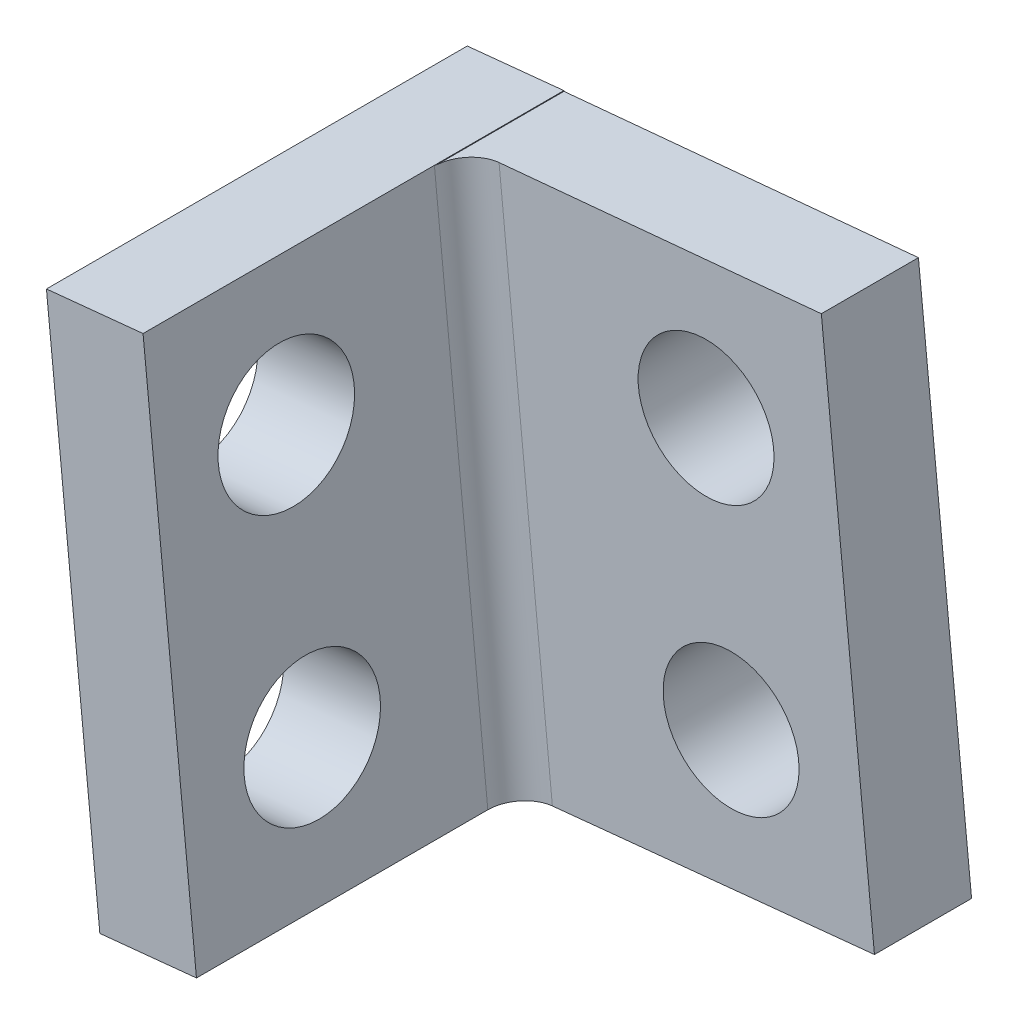
ISO-10303-21;
HEADER;
FILE_DESCRIPTION(('STEP AP214'),'2;1');
FILE_NAME('part.step','',(''),(''),'','','');
FILE_SCHEMA(('AUTOMOTIVE_DESIGN { 1 0 10303 214 1 1 1 1 }'));
ENDSEC;
DATA;
#1=APPLICATION_CONTEXT('core data for automotive mechanical design processes');
#2=APPLICATION_PROTOCOL_DEFINITION('international standard','automotive_design',2000,#1);
#3=PRODUCT_CONTEXT('',#1,'mechanical');
#4=PRODUCT('Part','Part','',(#3));
#5=PRODUCT_RELATED_PRODUCT_CATEGORY('part','',(#4));
#6=PRODUCT_DEFINITION_FORMATION('','',#4);
#7=PRODUCT_DEFINITION_CONTEXT('part definition',#1,'design');
#8=PRODUCT_DEFINITION('design','',#6,#7);
#9=PRODUCT_DEFINITION_SHAPE('','',#8);
#10=(LENGTH_UNIT() NAMED_UNIT(*) SI_UNIT(.MILLI.,.METRE.));
#11=(NAMED_UNIT(*) PLANE_ANGLE_UNIT() SI_UNIT($,.RADIAN.));
#12=(NAMED_UNIT(*) SI_UNIT($,.STERADIAN.) SOLID_ANGLE_UNIT());
#13=UNCERTAINTY_MEASURE_WITH_UNIT(LENGTH_MEASURE(1.E-05),#10,'distance_accuracy_value','');
#14=(GEOMETRIC_REPRESENTATION_CONTEXT(3) GLOBAL_UNCERTAINTY_ASSIGNED_CONTEXT((#13)) GLOBAL_UNIT_ASSIGNED_CONTEXT((#10,
#11,#12)) REPRESENTATION_CONTEXT('',''));
#15=CARTESIAN_POINT('',(0.,0.,0.));
#16=DIRECTION('',(0.,0.,1.));
#17=DIRECTION('',(1.,0.,0.));
#18=AXIS2_PLACEMENT_3D('',#15,#16,#17);
#19=CARTESIAN_POINT('',(0.,0.,3.));
#20=DIRECTION('',(0.,0.,1.));
#21=DIRECTION('',(1.,0.,0.));
#22=AXIS2_PLACEMENT_3D('',#19,#20,#21);
#23=PLANE('',#22);
#24=DIRECTION('',(-0.995631992695672,-0.0933645281723446,0.));
#25=VECTOR('',#24,1.);
#26=CARTESIAN_POINT('',(-91.0611521022606,46.0439123563639,3.));
#27=LINE('',#26,#25);
#28=CARTESIAN_POINT('',(-91.0611521022606,46.0439123563639,3.));
#29=VERTEX_POINT('',#28);
#30=CARTESIAN_POINT('',(-101.017383525646,45.1102753739863,3.));
#31=VERTEX_POINT('',#30);
#32=EDGE_CURVE('E154',#29,#31,#27,.T.);
#33=ORIENTED_EDGE('',*,*,#32,.T.);
#34=DIRECTION('',(-0.0999999999999992,0.99498743710662,0.));
#35=VECTOR('',#34,1.);
#36=CARTESIAN_POINT('',(-99.3700502515736,28.7195162496917,3.));
#37=LINE('',#36,#35);
#38=CARTESIAN_POINT('',(-99.3700502515736,28.7195162496917,3.));
#39=VERTEX_POINT('',#38);
#40=EDGE_CURVE('E60',#31,#39,#37,.F.);
#41=ORIENTED_EDGE('',*,*,#40,.T.);
#42=DIRECTION('',(0.99498743710662,0.0999999999999992,0.));
#43=VECTOR('',#42,1.);
#44=CARTESIAN_POINT('',(-103.35,28.3195162496917,3.));
#45=LINE('',#44,#43);
#46=CARTESIAN_POINT('',(-89.4201758805073,29.7195162496917,3.));
#47=VERTEX_POINT('',#46);
#48=EDGE_CURVE('E156',#39,#47,#45,.T.);
#49=ORIENTED_EDGE('',*,*,#48,.T.);
#50=DIRECTION('',(-0.100018867622405,0.994985540658522,0.));
#51=VECTOR('',#50,1.);
#52=CARTESIAN_POINT('',(-89.4201758805073,29.7195162496917,3.));
#53=LINE('',#52,#51);
#54=EDGE_CURVE('E159',#47,#29,#53,.T.);
#55=ORIENTED_EDGE('',*,*,#54,.T.);
#56=EDGE_LOOP('',(#33,#41,#49,#55));
#57=FACE_BOUND('',#56,.T.);
#58=CARTESIAN_POINT('',(-94.6220250588654,41.474945451225,3.));
#59=DIRECTION('',(0.,0.,1.));
#60=DIRECTION('',(1.,0.,0.));
#61=AXIS2_PLACEMENT_3D('',#58,#59,#60);
#62=CIRCLE('',#61,2.1);
#63=CARTESIAN_POINT('',(-92.5220250588654,41.474945451225,3.));
#64=VERTEX_POINT('',#63);
#65=EDGE_CURVE('E148',#64,#64,#62,.T.);
#66=ORIENTED_EDGE('',*,*,#65,.F.);
#67=EDGE_LOOP('',(#66));
#68=FACE_BOUND('',#67,.T.);
#69=CARTESIAN_POINT('',(-93.8485626491029,33.5124234951683,3.));
#70=DIRECTION('',(0.,0.,1.));
#71=DIRECTION('',(1.,0.,0.));
#72=AXIS2_PLACEMENT_3D('',#69,#70,#71);
#73=CIRCLE('',#72,2.1);
#74=CARTESIAN_POINT('',(-91.7485626491029,33.5124234951683,3.));
#75=VERTEX_POINT('',#74);
#76=EDGE_CURVE('E142',#75,#75,#73,.T.);
#77=ORIENTED_EDGE('',*,*,#76,.F.);
#78=EDGE_LOOP('',(#77));
#79=FACE_BOUND('',#78,.T.);
#80=ADVANCED_FACE('F39',(#57,#68,#79),#23,.T.);
#81=CARTESIAN_POINT('',(0.,0.,0.));
#82=DIRECTION('',(0.,0.,1.));
#83=DIRECTION('',(1.,0.,0.));
#84=AXIS2_PLACEMENT_3D('',#81,#82,#83);
#85=PLANE('',#84);
#86=DIRECTION('',(-0.100018867622405,0.994985540658522,0.));
#87=VECTOR('',#86,1.);
#88=CARTESIAN_POINT('',(-89.4201758805073,29.7195162496917,0.));
#89=LINE('',#88,#87);
#90=CARTESIAN_POINT('',(-89.4201758805073,29.7195162496917,0.));
#91=VERTEX_POINT('',#90);
#92=CARTESIAN_POINT('',(-91.0611521022606,46.0439123563639,0.));
#93=VERTEX_POINT('',#92);
#94=EDGE_CURVE('E157',#91,#93,#89,.T.);
#95=ORIENTED_EDGE('',*,*,#94,.F.);
#96=DIRECTION('',(0.99498743710662,0.0999999999999992,0.));
#97=VECTOR('',#96,1.);
#98=CARTESIAN_POINT('',(-103.35,28.3195162496917,0.));
#99=LINE('',#98,#97);
#100=CARTESIAN_POINT('',(-103.35,28.3195162496917,0.));
#101=VERTEX_POINT('',#100);
#102=EDGE_CURVE('E166',#101,#91,#99,.T.);
#103=ORIENTED_EDGE('',*,*,#102,.F.);
#104=DIRECTION('',(0.0999999999999992,-0.99498743710662,0.));
#105=VECTOR('',#104,1.);
#106=CARTESIAN_POINT('',(-105.,44.7368089619511,0.));
#107=LINE('',#106,#105);
#108=CARTESIAN_POINT('',(-105.,44.7368089619511,0.));
#109=VERTEX_POINT('',#108);
#110=EDGE_CURVE('E164',#109,#101,#107,.T.);
#111=ORIENTED_EDGE('',*,*,#110,.F.);
#112=DIRECTION('',(-0.99498743710662,-0.0999999999999992,0.));
#113=VECTOR('',#112,1.);
#114=CARTESIAN_POINT('',(-102.01503768868,45.0368089619511,0.));
#115=LINE('',#114,#113);
#116=CARTESIAN_POINT('',(-102.01503768868,45.0368089619511,0.));
#117=VERTEX_POINT('',#116);
#118=EDGE_CURVE('E136',#117,#109,#115,.T.);
#119=ORIENTED_EDGE('',*,*,#118,.F.);
#120=DIRECTION('',(0.0999999999999992,-0.99498743710662,0.));
#121=VECTOR('',#120,1.);
#122=CARTESIAN_POINT('',(-100.36503768868,28.6195162496917,0.));
#123=LINE('',#122,#121);
#124=CARTESIAN_POINT('',(-102.013037644234,45.0169087709775,0.));
#125=VERTEX_POINT('',#124);
#126=EDGE_CURVE('E115',#117,#125,#123,.T.);
#127=ORIENTED_EDGE('',*,*,#126,.T.);
#128=DIRECTION('',(-0.995631992695672,-0.0933645281723446,0.));
#129=VECTOR('',#128,1.);
#130=CARTESIAN_POINT('',(-91.0611521022606,46.0439123563639,0.));
#131=LINE('',#130,#129);
#132=EDGE_CURVE('E151',#93,#125,#131,.T.);
#133=ORIENTED_EDGE('',*,*,#132,.F.);
#134=EDGE_LOOP('',(#95,#103,#111,#119,#127,#133));
#135=FACE_BOUND('',#134,.T.);
#136=CARTESIAN_POINT('',(-94.6220250588654,41.474945451225,0.));
#137=DIRECTION('',(0.,0.,1.));
#138=DIRECTION('',(1.,0.,0.));
#139=AXIS2_PLACEMENT_3D('',#136,#137,#138);
#140=CIRCLE('',#139,2.1);
#141=CARTESIAN_POINT('',(-92.5220250588654,41.474945451225,0.));
#142=VERTEX_POINT('',#141);
#143=EDGE_CURVE('E145',#142,#142,#140,.T.);
#144=ORIENTED_EDGE('',*,*,#143,.T.);
#145=EDGE_LOOP('',(#144));
#146=FACE_BOUND('',#145,.T.);
#147=CARTESIAN_POINT('',(-93.8485626491029,33.5124234951683,0.));
#148=DIRECTION('',(0.,0.,1.));
#149=DIRECTION('',(1.,0.,0.));
#150=AXIS2_PLACEMENT_3D('',#147,#148,#149);
#151=CIRCLE('',#150,2.1);
#152=CARTESIAN_POINT('',(-91.7485626491029,33.5124234951683,0.));
#153=VERTEX_POINT('',#152);
#154=EDGE_CURVE('E141',#153,#153,#151,.T.);
#155=ORIENTED_EDGE('',*,*,#154,.T.);
#156=EDGE_LOOP('',(#155));
#157=FACE_BOUND('',#156,.T.);
#158=ADVANCED_FACE('F193',(#135,#146,#157),#85,.F.);
#159=CARTESIAN_POINT('',(-91.0611521022606,46.0439123563639,3.));
#160=DIRECTION('',(0.0933645281723446,-0.995631992695672,0.));
#161=DIRECTION('',(0.995631992695672,0.0933645281723446,0.));
#162=AXIS2_PLACEMENT_3D('',#159,#160,#161);
#163=PLANE('',#162);
#164=ORIENTED_EDGE('',*,*,#132,.T.);
#165=DIRECTION('',(0.,0.,1.));
#166=VECTOR('',#165,1.);
#167=CARTESIAN_POINT('',(-102.013037644234,45.0169087709775,3.));
#168=LINE('',#167,#166);
#169=CARTESIAN_POINT('',(-102.013037644234,45.0169087709775,4.));
#170=VERTEX_POINT('',#169);
#171=EDGE_CURVE('E138',#125,#170,#168,.T.);
#172=ORIENTED_EDGE('',*,*,#171,.T.);
#173=CARTESIAN_POINT('',(-101.017383525646,45.1102753739863,4.));
#174=DIRECTION('',(0.0933645281723446,-0.995631992695672,0.));
#175=DIRECTION('',(0.995631992695672,0.0933645281723446,0.));
#176=AXIS2_PLACEMENT_3D('',#173,#174,#175);
#177=ELLIPSE('',#176,1.00002222296299,1.);
#178=EDGE_CURVE('E47',#170,#31,#177,.T.);
#179=ORIENTED_EDGE('',*,*,#178,.T.);
#180=ORIENTED_EDGE('',*,*,#32,.F.);
#181=DIRECTION('',(0.,0.,-1.));
#182=VECTOR('',#181,1.);
#183=CARTESIAN_POINT('',(-91.0611521022606,46.0439123563639,3.));
#184=LINE('',#183,#182);
#185=EDGE_CURVE('E161',#29,#93,#184,.T.);
#186=ORIENTED_EDGE('',*,*,#185,.T.);
#187=EDGE_LOOP('',(#164,#172,#179,#180,#186));
#188=FACE_BOUND('',#187,.T.);
#189=ADVANCED_FACE('F199',(#188),#163,.F.);
#190=CARTESIAN_POINT('',(-105.,44.7368089619511,3.));
#191=DIRECTION('',(0.99498743710662,0.0999999999999991,0.));
#192=DIRECTION('',(-0.0999999999999992,0.99498743710662,0.));
#193=AXIS2_PLACEMENT_3D('',#190,#191,#192);
#194=PLANE('',#193);
#195=ORIENTED_EDGE('',*,*,#110,.T.);
#196=DIRECTION('',(0.,0.,-1.));
#197=VECTOR('',#196,1.);
#198=CARTESIAN_POINT('',(-103.35,28.3195162496917,3.));
#199=LINE('',#198,#197);
#200=CARTESIAN_POINT('',(-103.35,28.3195162496917,13.));
#201=VERTEX_POINT('',#200);
#202=EDGE_CURVE('E174',#201,#101,#199,.T.);
#203=ORIENTED_EDGE('',*,*,#202,.F.);
#204=DIRECTION('',(-0.0999999999999992,0.99498743710662,0.));
#205=VECTOR('',#204,1.);
#206=CARTESIAN_POINT('',(-103.35,28.3195162496917,13.));
#207=LINE('',#206,#205);
#208=CARTESIAN_POINT('',(-105.,44.7368089619511,13.));
#209=VERTEX_POINT('',#208);
#210=EDGE_CURVE('E123',#201,#209,#207,.T.);
#211=ORIENTED_EDGE('',*,*,#210,.T.);
#212=DIRECTION('',(0.,0.,-1.));
#213=VECTOR('',#212,1.);
#214=CARTESIAN_POINT('',(-105.,44.7368089619511,3.));
#215=LINE('',#214,#213);
#216=EDGE_CURVE('E176',#209,#109,#215,.T.);
#217=ORIENTED_EDGE('',*,*,#216,.T.);
#218=EDGE_LOOP('',(#195,#203,#211,#217));
#219=FACE_BOUND('',#218,.T.);
#220=CARTESIAN_POINT('',(-104.575,40.5081123542479,9.));
#221=DIRECTION('',(-0.99498743710662,-0.0999999999999992,0.));
#222=DIRECTION('',(0.0999999999999992,-0.99498743710662,0.));
#223=AXIS2_PLACEMENT_3D('',#220,#221,#222);
#224=CIRCLE('',#223,2.09999999999999);
#225=CARTESIAN_POINT('',(-104.365,38.418638736324,9.));
#226=VERTEX_POINT('',#225);
#227=EDGE_CURVE('E231',#226,#226,#224,.T.);
#228=ORIENTED_EDGE('',*,*,#227,.F.);
#229=EDGE_LOOP('',(#228));
#230=FACE_BOUND('',#229,.T.);
#231=CARTESIAN_POINT('',(-103.775,32.5482128573949,9.));
#232=DIRECTION('',(-0.99498743710662,-0.0999999999999992,0.));
#233=DIRECTION('',(0.0999999999999992,-0.99498743710662,0.));
#234=AXIS2_PLACEMENT_3D('',#231,#232,#233);
#235=CIRCLE('',#234,2.09999999999999);
#236=CARTESIAN_POINT('',(-103.565,30.458739239471,9.));
#237=VERTEX_POINT('',#236);
#238=EDGE_CURVE('E225',#237,#237,#235,.T.);
#239=ORIENTED_EDGE('',*,*,#238,.F.);
#240=EDGE_LOOP('',(#239));
#241=FACE_BOUND('',#240,.T.);
#242=ADVANCED_FACE('F213',(#219,#230,#241),#194,.F.);
#243=CARTESIAN_POINT('',(-103.35,28.3195162496917,3.));
#244=DIRECTION('',(-0.0999999999999992,0.99498743710662,0.));
#245=DIRECTION('',(-0.99498743710662,-0.0999999999999993,0.));
#246=AXIS2_PLACEMENT_3D('',#243,#244,#245);
#247=PLANE('',#246);
#248=ORIENTED_EDGE('',*,*,#48,.F.);
#249=CARTESIAN_POINT('',(-99.3700502515736,28.7195162496917,4.));
#250=DIRECTION('',(-0.0999999999999992,0.99498743710662,0.));
#251=DIRECTION('',(-0.99498743710662,-0.0999999999999993,0.));
#252=AXIS2_PLACEMENT_3D('',#249,#250,#251);
#253=CIRCLE('',#252,1.);
#254=CARTESIAN_POINT('',(-100.36503768868,28.6195162496917,4.));
#255=VERTEX_POINT('',#254);
#256=EDGE_CURVE('E11',#39,#255,#253,.T.);
#257=ORIENTED_EDGE('',*,*,#256,.T.);
#258=DIRECTION('',(0.,0.,1.));
#259=VECTOR('',#258,1.);
#260=CARTESIAN_POINT('',(-100.36503768868,28.6195162496917,0.));
#261=LINE('',#260,#259);
#262=CARTESIAN_POINT('',(-100.36503768868,28.6195162496917,13.));
#263=VERTEX_POINT('',#262);
#264=EDGE_CURVE('E103',#255,#263,#261,.T.);
#265=ORIENTED_EDGE('',*,*,#264,.T.);
#266=DIRECTION('',(-0.99498743710662,-0.0999999999999992,0.));
#267=VECTOR('',#266,1.);
#268=CARTESIAN_POINT('',(-100.36503768868,28.6195162496917,13.));
#269=LINE('',#268,#267);
#270=EDGE_CURVE('E107',#263,#201,#269,.T.);
#271=ORIENTED_EDGE('',*,*,#270,.T.);
#272=ORIENTED_EDGE('',*,*,#202,.T.);
#273=ORIENTED_EDGE('',*,*,#102,.T.);
#274=DIRECTION('',(0.,0.,-1.));
#275=VECTOR('',#274,1.);
#276=CARTESIAN_POINT('',(-89.4201758805073,29.7195162496917,3.));
#277=LINE('',#276,#275);
#278=EDGE_CURVE('E171',#47,#91,#277,.T.);
#279=ORIENTED_EDGE('',*,*,#278,.F.);
#280=EDGE_LOOP('',(#248,#257,#265,#271,#272,#273,#279));
#281=FACE_BOUND('',#280,.T.);
#282=ADVANCED_FACE('F105',(#281),#247,.F.);
#283=CARTESIAN_POINT('',(-89.4201758805073,29.7195162496917,3.));
#284=DIRECTION('',(-0.994985540658522,-0.100018867622405,0.));
#285=DIRECTION('',(0.100018867622405,-0.994985540658522,0.));
#286=AXIS2_PLACEMENT_3D('',#283,#284,#285);
#287=PLANE('',#286);
#288=ORIENTED_EDGE('',*,*,#94,.T.);
#289=ORIENTED_EDGE('',*,*,#185,.F.);
#290=ORIENTED_EDGE('',*,*,#54,.F.);
#291=ORIENTED_EDGE('',*,*,#278,.T.);
#292=EDGE_LOOP('',(#288,#289,#290,#291));
#293=FACE_BOUND('',#292,.T.);
#294=ADVANCED_FACE('F207',(#293),#287,.F.);
#295=CARTESIAN_POINT('',(-94.6220250588654,41.474945451225,3.));
#296=DIRECTION('',(0.,0.,-1.));
#297=DIRECTION('',(-1.,0.,0.));
#298=AXIS2_PLACEMENT_3D('',#295,#296,#297);
#299=CYLINDRICAL_SURFACE('',#298,2.1);
#300=ORIENTED_EDGE('',*,*,#65,.T.);
#301=EDGE_LOOP('',(#300));
#302=FACE_BOUND('',#301,.T.);
#303=ORIENTED_EDGE('',*,*,#143,.F.);
#304=EDGE_LOOP('',(#303));
#305=FACE_BOUND('',#304,.T.);
#306=ADVANCED_FACE('F204',(#302,#305),#299,.F.);
#307=CARTESIAN_POINT('',(-93.8485626491029,33.5124234951683,3.));
#308=DIRECTION('',(0.,0.,-1.));
#309=DIRECTION('',(-1.,0.,0.));
#310=AXIS2_PLACEMENT_3D('',#307,#308,#309);
#311=CYLINDRICAL_SURFACE('',#310,2.1);
#312=ORIENTED_EDGE('',*,*,#76,.T.);
#313=EDGE_LOOP('',(#312));
#314=FACE_BOUND('',#313,.T.);
#315=ORIENTED_EDGE('',*,*,#154,.F.);
#316=EDGE_LOOP('',(#315));
#317=FACE_BOUND('',#316,.T.);
#318=ADVANCED_FACE('F256',(#314,#317),#311,.F.);
#319=CARTESIAN_POINT('',(-102.01503768868,45.0368089619511,0.));
#320=DIRECTION('',(-0.0999999999999992,0.99498743710662,0.));
#321=DIRECTION('',(-0.99498743710662,-0.0999999999999992,0.));
#322=AXIS2_PLACEMENT_3D('',#319,#320,#321);
#323=PLANE('',#322);
#324=ORIENTED_EDGE('',*,*,#216,.F.);
#325=DIRECTION('',(-0.99498743710662,-0.0999999999999992,0.));
#326=VECTOR('',#325,1.);
#327=CARTESIAN_POINT('',(-102.01503768868,45.0368089619511,13.));
#328=LINE('',#327,#326);
#329=CARTESIAN_POINT('',(-102.01503768868,45.0368089619511,13.));
#330=VERTEX_POINT('',#329);
#331=EDGE_CURVE('E124',#330,#209,#328,.T.);
#332=ORIENTED_EDGE('',*,*,#331,.F.);
#333=DIRECTION('',(0.,0.,-1.));
#334=VECTOR('',#333,1.);
#335=CARTESIAN_POINT('',(-102.01503768868,45.0368089619511,0.));
#336=LINE('',#335,#334);
#337=EDGE_CURVE('E125',#330,#117,#336,.T.);
#338=ORIENTED_EDGE('',*,*,#337,.T.);
#339=ORIENTED_EDGE('',*,*,#118,.T.);
#340=EDGE_LOOP('',(#324,#332,#338,#339));
#341=FACE_BOUND('',#340,.T.);
#342=ADVANCED_FACE('F253',(#341),#323,.T.);
#343=CARTESIAN_POINT('',(-100.36503768868,28.6195162496917,13.));
#344=DIRECTION('',(0.,0.,1.));
#345=DIRECTION('',(1.,0.,0.));
#346=AXIS2_PLACEMENT_3D('',#343,#344,#345);
#347=PLANE('',#346);
#348=ORIENTED_EDGE('',*,*,#210,.F.);
#349=ORIENTED_EDGE('',*,*,#270,.F.);
#350=DIRECTION('',(-0.0999999999999992,0.99498743710662,0.));
#351=VECTOR('',#350,1.);
#352=CARTESIAN_POINT('',(-100.36503768868,28.6195162496917,13.));
#353=LINE('',#352,#351);
#354=EDGE_CURVE('E114',#263,#330,#353,.T.);
#355=ORIENTED_EDGE('',*,*,#354,.T.);
#356=ORIENTED_EDGE('',*,*,#331,.T.);
#357=EDGE_LOOP('',(#348,#349,#355,#356));
#358=FACE_BOUND('',#357,.T.);
#359=ADVANCED_FACE('F119',(#358),#347,.T.);
#360=CARTESIAN_POINT('',(-96.5137813993422,-9.69999999999993,0.));
#361=DIRECTION('',(0.99498743710662,0.0999999999999992,0.));
#362=DIRECTION('',(-0.0999999999999992,0.99498743710662,0.));
#363=AXIS2_PLACEMENT_3D('',#360,#361,#362);
#364=PLANE('',#363);
#365=CARTESIAN_POINT('',(-101.59003768868,40.8081123542479,9.));
#366=DIRECTION('',(-0.99498743710662,-0.0999999999999992,0.));
#367=DIRECTION('',(0.0999999999999992,-0.99498743710662,0.));
#368=AXIS2_PLACEMENT_3D('',#365,#366,#367);
#369=CIRCLE('',#368,2.09999999999999);
#370=CARTESIAN_POINT('',(-101.38003768868,38.718638736324,9.));
#371=VERTEX_POINT('',#370);
#372=EDGE_CURVE('E228',#371,#371,#369,.T.);
#373=ORIENTED_EDGE('',*,*,#372,.T.);
#374=EDGE_LOOP('',(#373));
#375=FACE_BOUND('',#374,.T.);
#376=CARTESIAN_POINT('',(-100.79003768868,32.8482128573949,9.));
#377=DIRECTION('',(-0.99498743710662,-0.0999999999999992,0.));
#378=DIRECTION('',(0.0999999999999992,-0.99498743710662,0.));
#379=AXIS2_PLACEMENT_3D('',#376,#377,#378);
#380=CIRCLE('',#379,2.09999999999999);
#381=CARTESIAN_POINT('',(-100.58003768868,30.758739239471,9.));
#382=VERTEX_POINT('',#381);
#383=EDGE_CURVE('E135',#382,#382,#380,.T.);
#384=ORIENTED_EDGE('',*,*,#383,.T.);
#385=EDGE_LOOP('',(#384));
#386=FACE_BOUND('',#385,.T.);
#387=ORIENTED_EDGE('',*,*,#264,.F.);
#388=DIRECTION('',(-0.0999999999999992,0.99498743710662,0.));
#389=VECTOR('',#388,1.);
#390=CARTESIAN_POINT('',(-102.013037644234,45.0169087709775,4.));
#391=LINE('',#390,#389);
#392=EDGE_CURVE('E179',#255,#170,#391,.T.);
#393=ORIENTED_EDGE('',*,*,#392,.T.);
#394=ORIENTED_EDGE('',*,*,#171,.F.);
#395=ORIENTED_EDGE('',*,*,#126,.F.);
#396=ORIENTED_EDGE('',*,*,#337,.F.);
#397=ORIENTED_EDGE('',*,*,#354,.F.);
#398=EDGE_LOOP('',(#387,#393,#394,#395,#396,#397));
#399=FACE_BOUND('',#398,.T.);
#400=ADVANCED_FACE('F127',(#375,#386,#399),#364,.T.);
#401=CARTESIAN_POINT('',(-100.79003768868,32.8482128573949,9.));
#402=DIRECTION('',(-0.99498743710662,-0.0999999999999992,0.));
#403=DIRECTION('',(0.0999999999999992,-0.99498743710662,0.));
#404=AXIS2_PLACEMENT_3D('',#401,#402,#403);
#405=CYLINDRICAL_SURFACE('',#404,2.09999999999999);
#406=ORIENTED_EDGE('',*,*,#383,.F.);
#407=EDGE_LOOP('',(#406));
#408=FACE_BOUND('',#407,.T.);
#409=ORIENTED_EDGE('',*,*,#238,.T.);
#410=EDGE_LOOP('',(#409));
#411=FACE_BOUND('',#410,.T.);
#412=ADVANCED_FACE('F189',(#408,#411),#405,.F.);
#413=CARTESIAN_POINT('',(-101.59003768868,40.8081123542479,9.));
#414=DIRECTION('',(-0.99498743710662,-0.0999999999999992,0.));
#415=DIRECTION('',(0.0999999999999992,-0.99498743710662,0.));
#416=AXIS2_PLACEMENT_3D('',#413,#414,#415);
#417=CYLINDRICAL_SURFACE('',#416,2.09999999999999);
#418=ORIENTED_EDGE('',*,*,#372,.F.);
#419=EDGE_LOOP('',(#418));
#420=FACE_BOUND('',#419,.T.);
#421=ORIENTED_EDGE('',*,*,#227,.T.);
#422=EDGE_LOOP('',(#421));
#423=FACE_BOUND('',#422,.T.);
#424=ADVANCED_FACE('F184',(#420,#423),#417,.F.);
#425=CARTESIAN_POINT('',(-95.5187939622356,-9.59999999999993,4.));
#426=DIRECTION('',(0.0999999999999992,-0.99498743710662,0.));
#427=DIRECTION('',(0.99498743710662,0.0999999999999992,0.));
#428=AXIS2_PLACEMENT_3D('',#425,#426,#427);
#429=CYLINDRICAL_SURFACE('',#428,1.);
#430=ORIENTED_EDGE('',*,*,#256,.F.);
#431=ORIENTED_EDGE('',*,*,#40,.F.);
#432=ORIENTED_EDGE('',*,*,#178,.F.);
#433=ORIENTED_EDGE('',*,*,#392,.F.);
#434=EDGE_LOOP('',(#430,#431,#432,#433));
#435=FACE_BOUND('',#434,.T.);
#436=ADVANCED_FACE('F41',(#435),#429,.F.);
#437=CLOSED_SHELL('',(#80,#158,#189,#242,#282,#294,#306,#318,#342,#359,#400,#412,#424,#436));
#438=MANIFOLD_SOLID_BREP('B2',#437);
#439=ADVANCED_BREP_SHAPE_REPRESENTATION('',(#18,#438),#14);
#440=SHAPE_DEFINITION_REPRESENTATION(#9,#439);
ENDSEC;
END-ISO-10303-21;
